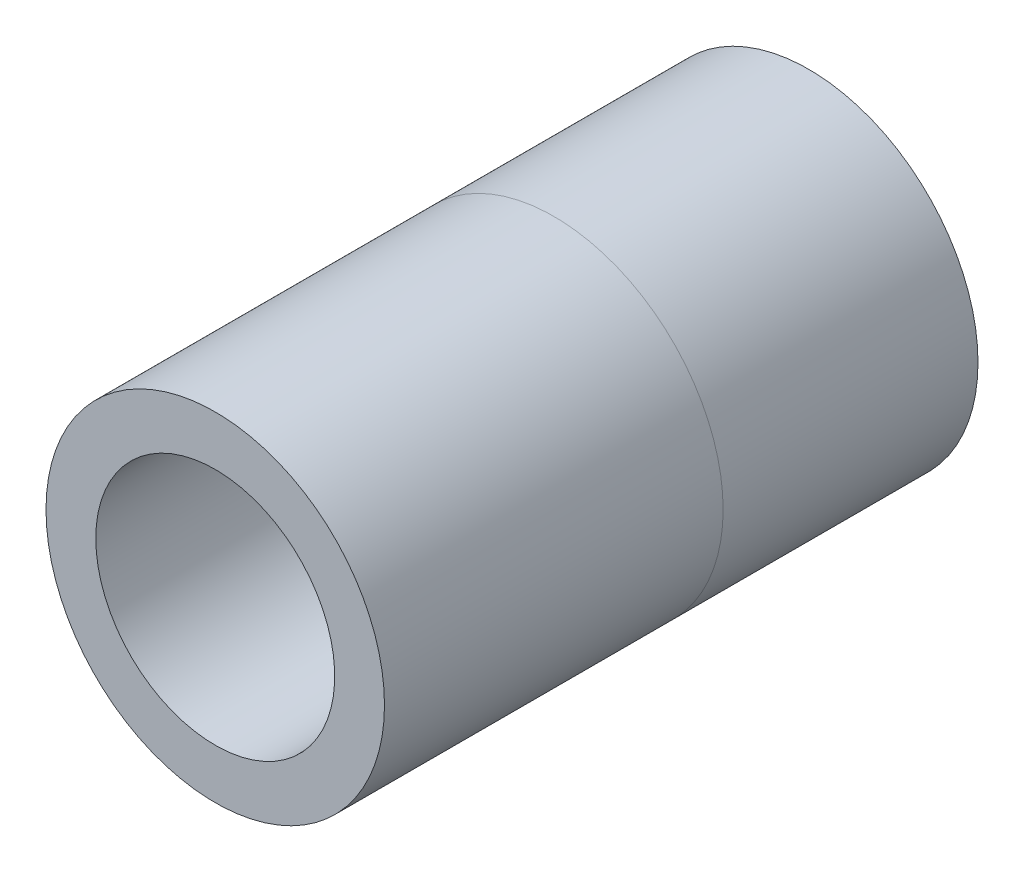
ISO-10303-21;
HEADER;
FILE_DESCRIPTION(('STEP AP214'),'2;1');
FILE_NAME('part.step','',(''),(''),'','','');
FILE_SCHEMA(('AUTOMOTIVE_DESIGN { 1 0 10303 214 1 1 1 1 }'));
ENDSEC;
DATA;
#1=APPLICATION_CONTEXT('core data for automotive mechanical design processes');
#2=APPLICATION_PROTOCOL_DEFINITION('international standard','automotive_design',2000,#1);
#3=PRODUCT_CONTEXT('',#1,'mechanical');
#4=PRODUCT('Part','Part','',(#3));
#5=PRODUCT_RELATED_PRODUCT_CATEGORY('part','',(#4));
#6=PRODUCT_DEFINITION_FORMATION('','',#4);
#7=PRODUCT_DEFINITION_CONTEXT('part definition',#1,'design');
#8=PRODUCT_DEFINITION('design','',#6,#7);
#9=PRODUCT_DEFINITION_SHAPE('','',#8);
#10=(LENGTH_UNIT() NAMED_UNIT(*) SI_UNIT(.MILLI.,.METRE.));
#11=(NAMED_UNIT(*) PLANE_ANGLE_UNIT() SI_UNIT($,.RADIAN.));
#12=(NAMED_UNIT(*) SI_UNIT($,.STERADIAN.) SOLID_ANGLE_UNIT());
#13=UNCERTAINTY_MEASURE_WITH_UNIT(LENGTH_MEASURE(1.E-05),#10,'distance_accuracy_value','');
#14=(GEOMETRIC_REPRESENTATION_CONTEXT(3) GLOBAL_UNCERTAINTY_ASSIGNED_CONTEXT((#13)) GLOBAL_UNIT_ASSIGNED_CONTEXT((#10,
#11,#12)) REPRESENTATION_CONTEXT('',''));
#15=CARTESIAN_POINT('',(0.,0.,0.));
#16=DIRECTION('',(0.,0.,1.));
#17=DIRECTION('',(1.,0.,0.));
#18=AXIS2_PLACEMENT_3D('',#15,#16,#17);
#19=CARTESIAN_POINT('',(-90.1376004227109,20.5420963068418,-20.3199999992038));
#20=DIRECTION('',(-2.9394939650947E-12,2.86401827797327E-12,-1.));
#21=DIRECTION('',(-1.,0.,2.9394939650947E-12));
#22=AXIS2_PLACEMENT_3D('',#19,#20,#21);
#23=PLANE('',#22);
#24=CARTESIAN_POINT('',(-90.1376004227109,20.5420963068418,-20.3199999992038));
#25=DIRECTION('',(-2.9394939650947E-12,2.86401827797327E-12,-1.));
#26=DIRECTION('',(-1.,0.,2.9394939650947E-12));
#27=AXIS2_PLACEMENT_3D('',#24,#25,#26);
#28=CIRCLE('',#27,9.52500000000001);
#29=CARTESIAN_POINT('',(-99.6626004227109,20.5420963068418,-20.3199999991758));
#30=VERTEX_POINT('',#29);
#31=EDGE_CURVE('E79',#30,#30,#28,.T.);
#32=ORIENTED_EDGE('',*,*,#31,.F.);
#33=EDGE_LOOP('',(#32));
#34=FACE_BOUND('',#33,.T.);
#35=CARTESIAN_POINT('',(-90.1376004227109,20.5420963068418,-20.3199999992038));
#36=DIRECTION('',(-2.9394939650947E-12,2.86401827797327E-12,-1.));
#37=DIRECTION('',(-1.,0.,2.9394939650947E-12));
#38=AXIS2_PLACEMENT_3D('',#35,#36,#37);
#39=CIRCLE('',#38,13.49375);
#40=CARTESIAN_POINT('',(-103.631350422711,20.5420963068418,-20.3199999991641));
#41=VERTEX_POINT('',#40);
#42=EDGE_CURVE('E73',#41,#41,#39,.T.);
#43=ORIENTED_EDGE('',*,*,#42,.T.);
#44=EDGE_LOOP('',(#43));
#45=FACE_BOUND('',#44,.T.);
#46=ADVANCED_FACE('F60',(#34,#45),#23,.T.);
#47=CARTESIAN_POINT('',(-90.1376004229652,20.5420963068143,27.0000003420486));
#48=DIRECTION('',(-2.9394939650947E-12,2.86401827797327E-12,-1.));
#49=DIRECTION('',(-1.,0.,2.9394939650947E-12));
#50=AXIS2_PLACEMENT_3D('',#47,#48,#49);
#51=PLANE('',#50);
#52=CARTESIAN_POINT('',(-90.1376004227408,20.5420963067526,27.0000003420486));
#53=DIRECTION('',(-2.9394939650947E-12,2.86401827797327E-12,-1.));
#54=DIRECTION('',(-1.,0.,2.9394939650947E-12));
#55=AXIS2_PLACEMENT_3D('',#52,#53,#54);
#56=CIRCLE('',#55,9.52500000000001);
#57=CARTESIAN_POINT('',(-99.6626004227408,20.5420963067526,27.0000003420766));
#58=VERTEX_POINT('',#57);
#59=EDGE_CURVE('E85',#58,#58,#56,.T.);
#60=ORIENTED_EDGE('',*,*,#59,.T.);
#61=EDGE_LOOP('',(#60));
#62=FACE_BOUND('',#61,.T.);
#63=CARTESIAN_POINT('',(-90.1376004229652,20.5420963068143,27.0000003420486));
#64=DIRECTION('',(-2.9394939650947E-12,2.86401827797327E-12,-1.));
#65=DIRECTION('',(-1.,0.,2.9394939650947E-12));
#66=AXIS2_PLACEMENT_3D('',#63,#64,#65);
#67=CIRCLE('',#66,13.49375);
#68=CARTESIAN_POINT('',(-103.631350422965,20.5420963068143,27.0000003420882));
#69=VERTEX_POINT('',#68);
#70=EDGE_CURVE('E11',#69,#69,#67,.T.);
#71=ORIENTED_EDGE('',*,*,#70,.F.);
#72=EDGE_LOOP('',(#71));
#73=FACE_BOUND('',#72,.T.);
#74=ADVANCED_FACE('F95',(#62,#73),#51,.F.);
#75=CARTESIAN_POINT('',(-90.1376004227109,20.5420963068418,-20.3199999992038));
#76=DIRECTION('',(-5.37354500353759E-12,-5.80346958154051E-13,1.));
#77=DIRECTION('',(1.,0.,5.37354500353759E-12));
#78=AXIS2_PLACEMENT_3D('',#75,#76,#77);
#79=CYLINDRICAL_SURFACE('',#78,13.49375);
#80=CARTESIAN_POINT('',(-90.1376004228201,20.54209630683,7.96234606026403E-10));
#81=DIRECTION('',(-2.9394939650947E-12,2.86401827797327E-12,-1.));
#82=DIRECTION('',(-1.,0.,2.9394939650947E-12));
#83=AXIS2_PLACEMENT_3D('',#80,#81,#82);
#84=CIRCLE('',#83,13.49375);
#85=CARTESIAN_POINT('',(-103.63135042282,20.54209630683,8.35899402717899E-10));
#86=VERTEX_POINT('',#85);
#87=EDGE_CURVE('E67',#86,#86,#84,.T.);
#88=ORIENTED_EDGE('',*,*,#87,.T.);
#89=EDGE_LOOP('',(#88));
#90=FACE_BOUND('',#89,.T.);
#91=ORIENTED_EDGE('',*,*,#42,.F.);
#92=EDGE_LOOP('',(#91));
#93=FACE_BOUND('',#92,.T.);
#94=ADVANCED_FACE('F115',(#90,#93),#79,.T.);
#95=CARTESIAN_POINT('',(-90.1376004230446,20.5420963068916,0.));
#96=DIRECTION('',(2.93849303304326E-12,-2.86422116960532E-12,1.));
#97=DIRECTION('',(1.,0.,-2.93849303304326E-12));
#98=AXIS2_PLACEMENT_3D('',#95,#96,#97);
#99=CYLINDRICAL_SURFACE('',#98,13.49375);
#100=ORIENTED_EDGE('',*,*,#70,.T.);
#101=EDGE_LOOP('',(#100));
#102=FACE_BOUND('',#101,.T.);
#103=ORIENTED_EDGE('',*,*,#87,.F.);
#104=EDGE_LOOP('',(#103));
#105=FACE_BOUND('',#104,.T.);
#106=ADVANCED_FACE('F107',(#102,#105),#99,.T.);
#107=CARTESIAN_POINT('',(-90.1376004226841,20.5420963068447,-25.3200000031849));
#108=DIRECTION('',(-5.37353205554582E-12,-5.80296518136387E-13,1.));
#109=DIRECTION('',(1.,0.,5.37353205554582E-12));
#110=AXIS2_PLACEMENT_3D('',#107,#108,#109);
#111=CYLINDRICAL_SURFACE('',#110,9.52500000000001);
#112=CARTESIAN_POINT('',(-90.1376004228201,20.54209630683,7.96272769942874E-10));
#113=DIRECTION('',(-2.9394939650947E-12,2.86401827797327E-12,-1.));
#114=DIRECTION('',(-1.,0.,2.9394939650947E-12));
#115=AXIS2_PLACEMENT_3D('',#112,#113,#114);
#116=CIRCLE('',#115,9.52500000000001);
#117=CARTESIAN_POINT('',(-99.6626004228201,20.54209630683,8.24271449960401E-10));
#118=VERTEX_POINT('',#117);
#119=EDGE_CURVE('E86',#118,#118,#116,.T.);
#120=ORIENTED_EDGE('',*,*,#119,.F.);
#121=EDGE_LOOP('',(#120));
#122=FACE_BOUND('',#121,.T.);
#123=ORIENTED_EDGE('',*,*,#31,.T.);
#124=EDGE_LOOP('',(#123));
#125=FACE_BOUND('',#124,.T.);
#126=ADVANCED_FACE('F101',(#122,#125),#111,.F.);
#127=CARTESIAN_POINT('',(-90.1376004228201,20.54209630683,7.96303994965442E-10));
#128=DIRECTION('',(2.93862153689366E-12,-2.86424526865617E-12,1.));
#129=DIRECTION('',(1.,0.,-2.93862153689366E-12));
#130=AXIS2_PLACEMENT_3D('',#127,#128,#129);
#131=CYLINDRICAL_SURFACE('',#130,9.52500000000001);
#132=ORIENTED_EDGE('',*,*,#59,.F.);
#133=EDGE_LOOP('',(#132));
#134=FACE_BOUND('',#133,.T.);
#135=ORIENTED_EDGE('',*,*,#119,.T.);
#136=EDGE_LOOP('',(#135));
#137=FACE_BOUND('',#136,.T.);
#138=ADVANCED_FACE('F98',(#134,#137),#131,.F.);
#139=CLOSED_SHELL('',(#46,#74,#94,#106,#126,#138));
#140=MANIFOLD_SOLID_BREP('B2',#139);
#141=ADVANCED_BREP_SHAPE_REPRESENTATION('',(#18,#140),#14);
#142=SHAPE_DEFINITION_REPRESENTATION(#9,#141);
ENDSEC;
END-ISO-10303-21;
